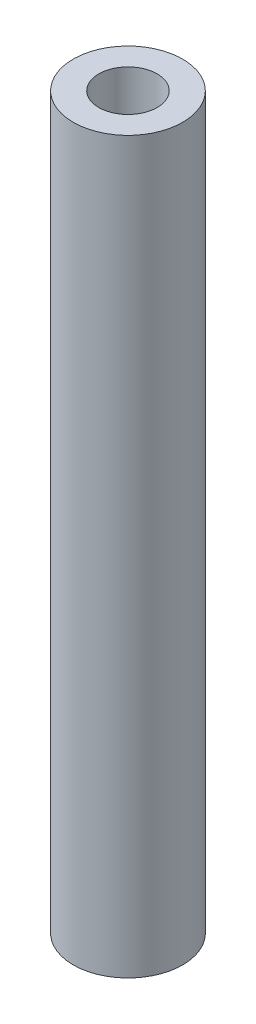
ISO-10303-21;
HEADER;
FILE_DESCRIPTION(('STEP AP214'),'2;1');
FILE_NAME('part.step','',(''),(''),'','','');
FILE_SCHEMA(('AUTOMOTIVE_DESIGN { 1 0 10303 214 1 1 1 1 }'));
ENDSEC;
DATA;
#1=APPLICATION_CONTEXT('core data for automotive mechanical design processes');
#2=APPLICATION_PROTOCOL_DEFINITION('international standard','automotive_design',2000,#1);
#3=PRODUCT_CONTEXT('',#1,'mechanical');
#4=PRODUCT('Part','Part','',(#3));
#5=PRODUCT_RELATED_PRODUCT_CATEGORY('part','',(#4));
#6=PRODUCT_DEFINITION_FORMATION('','',#4);
#7=PRODUCT_DEFINITION_CONTEXT('part definition',#1,'design');
#8=PRODUCT_DEFINITION('design','',#6,#7);
#9=PRODUCT_DEFINITION_SHAPE('','',#8);
#10=(LENGTH_UNIT() NAMED_UNIT(*) SI_UNIT(.MILLI.,.METRE.));
#11=(NAMED_UNIT(*) PLANE_ANGLE_UNIT() SI_UNIT($,.RADIAN.));
#12=(NAMED_UNIT(*) SI_UNIT($,.STERADIAN.) SOLID_ANGLE_UNIT());
#13=UNCERTAINTY_MEASURE_WITH_UNIT(LENGTH_MEASURE(1.E-05),#10,'distance_accuracy_value','');
#14=(GEOMETRIC_REPRESENTATION_CONTEXT(3) GLOBAL_UNCERTAINTY_ASSIGNED_CONTEXT((#13)) GLOBAL_UNIT_ASSIGNED_CONTEXT((#10,
#11,#12)) REPRESENTATION_CONTEXT('',''));
#15=CARTESIAN_POINT('',(0.,0.,0.));
#16=DIRECTION('',(0.,0.,1.));
#17=DIRECTION('',(1.,0.,0.));
#18=AXIS2_PLACEMENT_3D('',#15,#16,#17);
#19=CARTESIAN_POINT('',(0.,40.,0.));
#20=DIRECTION('',(0.,1.,0.));
#21=DIRECTION('',(0.,0.,1.));
#22=AXIS2_PLACEMENT_3D('',#19,#20,#21);
#23=PLANE('',#22);
#24=CARTESIAN_POINT('',(0.,40.,0.));
#25=DIRECTION('',(0.,1.,0.));
#26=DIRECTION('',(0.,0.,1.));
#27=AXIS2_PLACEMENT_3D('',#24,#25,#26);
#28=CIRCLE('',#27,3.);
#29=CARTESIAN_POINT('',(0.,40.,3.));
#30=VERTEX_POINT('',#29);
#31=EDGE_CURVE('E10',#30,#30,#28,.T.);
#32=ORIENTED_EDGE('',*,*,#31,.T.);
#33=EDGE_LOOP('',(#32));
#34=FACE_BOUND('',#33,.T.);
#35=CARTESIAN_POINT('',(0.,40.,0.));
#36=DIRECTION('',(0.,1.,0.));
#37=DIRECTION('',(0.,0.,1.));
#38=AXIS2_PLACEMENT_3D('',#35,#36,#37);
#39=CIRCLE('',#38,1.6);
#40=CARTESIAN_POINT('',(0.,40.,1.6));
#41=VERTEX_POINT('',#40);
#42=EDGE_CURVE('E52',#41,#41,#39,.T.);
#43=ORIENTED_EDGE('',*,*,#42,.F.);
#44=EDGE_LOOP('',(#43));
#45=FACE_BOUND('',#44,.T.);
#46=ADVANCED_FACE('F41',(#34,#45),#23,.T.);
#47=CARTESIAN_POINT('',(0.,0.,0.));
#48=DIRECTION('',(0.,1.,0.));
#49=DIRECTION('',(0.,0.,1.));
#50=AXIS2_PLACEMENT_3D('',#47,#48,#49);
#51=PLANE('',#50);
#52=CARTESIAN_POINT('',(0.,0.,0.));
#53=DIRECTION('',(0.,1.,0.));
#54=DIRECTION('',(0.,0.,1.));
#55=AXIS2_PLACEMENT_3D('',#52,#53,#54);
#56=CIRCLE('',#55,3.);
#57=CARTESIAN_POINT('',(0.,0.,3.));
#58=VERTEX_POINT('',#57);
#59=EDGE_CURVE('E45',#58,#58,#56,.T.);
#60=ORIENTED_EDGE('',*,*,#59,.F.);
#61=EDGE_LOOP('',(#60));
#62=FACE_BOUND('',#61,.T.);
#63=CARTESIAN_POINT('',(0.,0.,0.));
#64=DIRECTION('',(0.,1.,0.));
#65=DIRECTION('',(0.,0.,1.));
#66=AXIS2_PLACEMENT_3D('',#63,#64,#65);
#67=CIRCLE('',#66,1.6);
#68=CARTESIAN_POINT('',(0.,0.,1.6));
#69=VERTEX_POINT('',#68);
#70=EDGE_CURVE('E54',#69,#69,#67,.T.);
#71=ORIENTED_EDGE('',*,*,#70,.T.);
#72=EDGE_LOOP('',(#71));
#73=FACE_BOUND('',#72,.T.);
#74=ADVANCED_FACE('F64',(#62,#73),#51,.F.);
#75=CARTESIAN_POINT('',(0.,40.,0.));
#76=DIRECTION('',(0.,-1.,0.));
#77=DIRECTION('',(0.,0.,-1.));
#78=AXIS2_PLACEMENT_3D('',#75,#76,#77);
#79=CYLINDRICAL_SURFACE('',#78,3.);
#80=ORIENTED_EDGE('',*,*,#31,.F.);
#81=EDGE_LOOP('',(#80));
#82=FACE_BOUND('',#81,.T.);
#83=ORIENTED_EDGE('',*,*,#59,.T.);
#84=EDGE_LOOP('',(#83));
#85=FACE_BOUND('',#84,.T.);
#86=ADVANCED_FACE('F43',(#82,#85),#79,.T.);
#87=CARTESIAN_POINT('',(0.,40.,0.));
#88=DIRECTION('',(0.,-1.,0.));
#89=DIRECTION('',(0.,0.,-1.));
#90=AXIS2_PLACEMENT_3D('',#87,#88,#89);
#91=CYLINDRICAL_SURFACE('',#90,1.6);
#92=ORIENTED_EDGE('',*,*,#42,.T.);
#93=EDGE_LOOP('',(#92));
#94=FACE_BOUND('',#93,.T.);
#95=ORIENTED_EDGE('',*,*,#70,.F.);
#96=EDGE_LOOP('',(#95));
#97=FACE_BOUND('',#96,.T.);
#98=ADVANCED_FACE('F60',(#94,#97),#91,.F.);
#99=CLOSED_SHELL('',(#46,#74,#86,#98));
#100=MANIFOLD_SOLID_BREP('B2',#99);
#101=ADVANCED_BREP_SHAPE_REPRESENTATION('',(#18,#100),#14);
#102=SHAPE_DEFINITION_REPRESENTATION(#9,#101);
ENDSEC;
END-ISO-10303-21;
